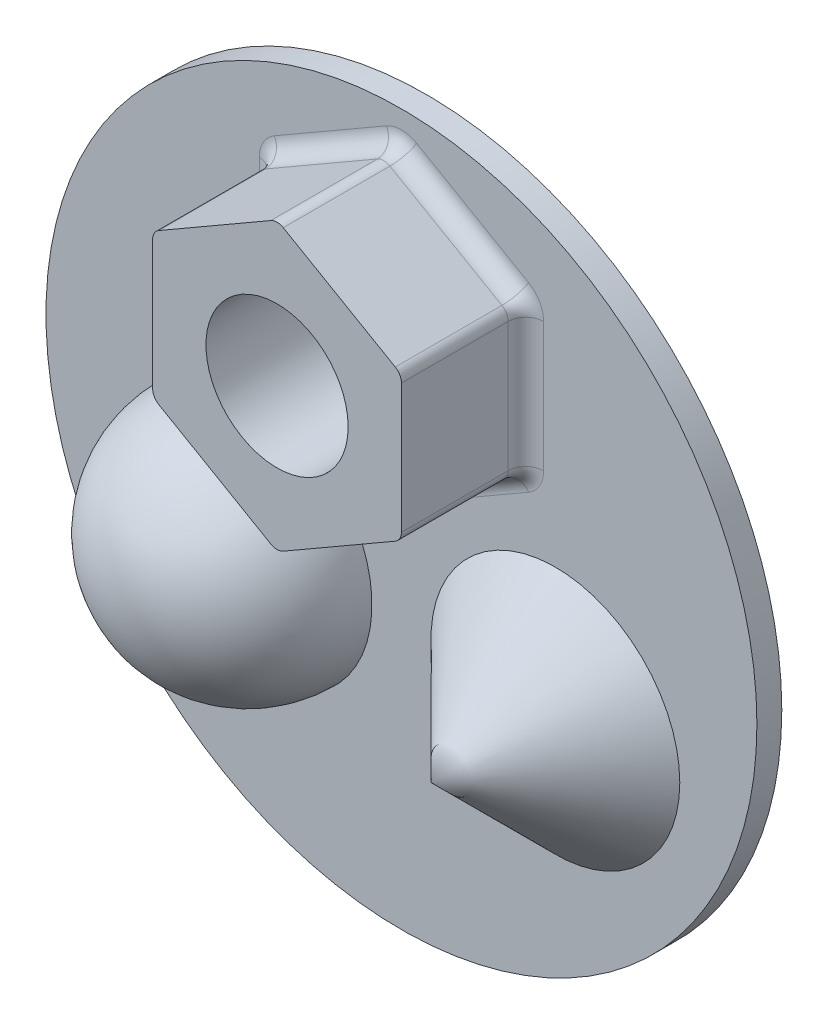
ISO-10303-21;
HEADER;
FILE_DESCRIPTION(('STEP AP214'),'2;1');
FILE_NAME('part.step','',(''),(''),'','','');
FILE_SCHEMA(('AUTOMOTIVE_DESIGN { 1 0 10303 214 1 1 1 1 }'));
ENDSEC;
DATA;
#1=APPLICATION_CONTEXT('core data for automotive mechanical design processes');
#2=APPLICATION_PROTOCOL_DEFINITION('international standard','automotive_design',2000,#1);
#3=PRODUCT_CONTEXT('',#1,'mechanical');
#4=PRODUCT('Part','Part','',(#3));
#5=PRODUCT_RELATED_PRODUCT_CATEGORY('part','',(#4));
#6=PRODUCT_DEFINITION_FORMATION('','',#4);
#7=PRODUCT_DEFINITION_CONTEXT('part definition',#1,'design');
#8=PRODUCT_DEFINITION('design','',#6,#7);
#9=PRODUCT_DEFINITION_SHAPE('','',#8);
#10=(LENGTH_UNIT() NAMED_UNIT(*) SI_UNIT(.MILLI.,.METRE.));
#11=(NAMED_UNIT(*) PLANE_ANGLE_UNIT() SI_UNIT($,.RADIAN.));
#12=(NAMED_UNIT(*) SI_UNIT($,.STERADIAN.) SOLID_ANGLE_UNIT());
#13=UNCERTAINTY_MEASURE_WITH_UNIT(LENGTH_MEASURE(1.E-05),#10,'distance_accuracy_value','');
#14=(GEOMETRIC_REPRESENTATION_CONTEXT(3) GLOBAL_UNCERTAINTY_ASSIGNED_CONTEXT((#13)) GLOBAL_UNIT_ASSIGNED_CONTEXT((#10,
#11,#12)) REPRESENTATION_CONTEXT('',''));
#15=CARTESIAN_POINT('',(0.,0.,0.));
#16=DIRECTION('',(0.,0.,1.));
#17=DIRECTION('',(1.,0.,0.));
#18=AXIS2_PLACEMENT_3D('',#15,#16,#17);
#19=CARTESIAN_POINT('',(0.,0.,0.7));
#20=DIRECTION('',(0.,0.,1.));
#21=DIRECTION('',(1.,0.,0.));
#22=AXIS2_PLACEMENT_3D('',#19,#20,#21);
#23=PLANE('',#22);
#24=DIRECTION('',(0.,1.,0.));
#25=VECTOR('',#24,1.);
#26=CARTESIAN_POINT('',(4.,0.,0.7));
#27=LINE('',#26,#25);
#28=CARTESIAN_POINT('',(4.,6.81865334794733,0.7));
#29=VERTEX_POINT('',#28);
#30=CARTESIAN_POINT('',(4.,3.18134665205268,0.7));
#31=VERTEX_POINT('',#30);
#32=EDGE_CURVE('E259',#29,#31,#27,.F.);
#33=ORIENTED_EDGE('',*,*,#32,.T.);
#34=CARTESIAN_POINT('',(3.15,3.18134665205268,0.7));
#35=DIRECTION('',(0.,0.,1.));
#36=DIRECTION('',(1.,0.,0.));
#37=AXIS2_PLACEMENT_3D('',#34,#35,#36);
#38=CIRCLE('',#37,0.85);
#39=CARTESIAN_POINT('',(3.575,2.44522505883591,0.7));
#40=VERTEX_POINT('',#39);
#41=EDGE_CURVE('E281',#31,#40,#38,.F.);
#42=ORIENTED_EDGE('',*,*,#41,.T.);
#43=DIRECTION('',(0.866025403784439,0.5,0.));
#44=VECTOR('',#43,1.);
#45=CARTESIAN_POINT('',(-0.165063509461096,0.285898384862245,0.7));
#46=LINE('',#45,#44);
#47=CARTESIAN_POINT('',(0.425,0.626571710888585,0.7));
#48=VERTEX_POINT('',#47);
#49=EDGE_CURVE('E279',#40,#48,#46,.F.);
#50=ORIENTED_EDGE('',*,*,#49,.T.);
#51=CARTESIAN_POINT('',(0.,1.36269330410536,0.7));
#52=DIRECTION('',(0.,0.,1.));
#53=DIRECTION('',(1.,0.,0.));
#54=AXIS2_PLACEMENT_3D('',#51,#52,#53);
#55=CIRCLE('',#54,0.85);
#56=CARTESIAN_POINT('',(-0.425000000000001,0.626571710888585,0.7));
#57=VERTEX_POINT('',#56);
#58=EDGE_CURVE('E277',#48,#57,#55,.F.);
#59=ORIENTED_EDGE('',*,*,#58,.T.);
#60=DIRECTION('',(0.866025403784439,-0.5,0.));
#61=VECTOR('',#60,1.);
#62=CARTESIAN_POINT('',(0.165063509461096,0.285898384862245,0.7));
#63=LINE('',#62,#61);
#64=CARTESIAN_POINT('',(-3.575,2.44522505883591,0.7));
#65=VERTEX_POINT('',#64);
#66=EDGE_CURVE('E275',#57,#65,#63,.F.);
#67=ORIENTED_EDGE('',*,*,#66,.T.);
#68=CARTESIAN_POINT('',(-3.15,3.18134665205268,0.7));
#69=DIRECTION('',(0.,0.,1.));
#70=DIRECTION('',(1.,0.,0.));
#71=AXIS2_PLACEMENT_3D('',#68,#69,#70);
#72=CIRCLE('',#71,0.85);
#73=CARTESIAN_POINT('',(-4.,3.18134665205268,0.7));
#74=VERTEX_POINT('',#73);
#75=EDGE_CURVE('E273',#65,#74,#72,.F.);
#76=ORIENTED_EDGE('',*,*,#75,.T.);
#77=DIRECTION('',(0.,-1.,0.));
#78=VECTOR('',#77,1.);
#79=CARTESIAN_POINT('',(-4.,0.,0.7));
#80=LINE('',#79,#78);
#81=CARTESIAN_POINT('',(-4.,6.81865334794732,0.7));
#82=VERTEX_POINT('',#81);
#83=EDGE_CURVE('E271',#74,#82,#80,.F.);
#84=ORIENTED_EDGE('',*,*,#83,.T.);
#85=CARTESIAN_POINT('',(-3.15,6.81865334794732,0.7));
#86=DIRECTION('',(0.,0.,1.));
#87=DIRECTION('',(1.,0.,0.));
#88=AXIS2_PLACEMENT_3D('',#85,#86,#87);
#89=CIRCLE('',#88,0.85);
#90=CARTESIAN_POINT('',(-3.575,7.55477494116409,0.7));
#91=VERTEX_POINT('',#90);
#92=EDGE_CURVE('E269',#82,#91,#89,.F.);
#93=ORIENTED_EDGE('',*,*,#92,.T.);
#94=DIRECTION('',(-0.866025403784438,-0.500000000000001,0.));
#95=VECTOR('',#94,1.);
#96=CARTESIAN_POINT('',(-4.1650635094611,7.21410161513775,0.7));
#97=LINE('',#96,#95);
#98=CARTESIAN_POINT('',(-0.424999999999998,9.37342828911142,0.7));
#99=VERTEX_POINT('',#98);
#100=EDGE_CURVE('E267',#91,#99,#97,.F.);
#101=ORIENTED_EDGE('',*,*,#100,.T.);
#102=CARTESIAN_POINT('',(0.,8.63730669589465,0.7));
#103=DIRECTION('',(0.,0.,1.));
#104=DIRECTION('',(1.,0.,0.));
#105=AXIS2_PLACEMENT_3D('',#102,#103,#104);
#106=CIRCLE('',#105,0.85);
#107=CARTESIAN_POINT('',(0.425000000000003,9.37342828911142,0.7));
#108=VERTEX_POINT('',#107);
#109=EDGE_CURVE('E265',#99,#108,#106,.F.);
#110=ORIENTED_EDGE('',*,*,#109,.T.);
#111=DIRECTION('',(-0.866025403784439,0.5,0.));
#112=VECTOR('',#111,1.);
#113=CARTESIAN_POINT('',(4.1650635094611,7.21410161513776,0.7));
#114=LINE('',#113,#112);
#115=CARTESIAN_POINT('',(3.575,7.5547749411641,0.7));
#116=VERTEX_POINT('',#115);
#117=EDGE_CURVE('E263',#108,#116,#114,.F.);
#118=ORIENTED_EDGE('',*,*,#117,.T.);
#119=CARTESIAN_POINT('',(3.15,6.81865334794733,0.7));
#120=DIRECTION('',(0.,0.,1.));
#121=DIRECTION('',(1.,0.,0.));
#122=AXIS2_PLACEMENT_3D('',#119,#120,#121);
#123=CIRCLE('',#122,0.85);
#124=EDGE_CURVE('E261',#116,#29,#123,.F.);
#125=ORIENTED_EDGE('',*,*,#124,.T.);
#126=EDGE_LOOP('',(#33,#42,#50,#59,#67,#76,#84,#93,#101,#110,#118,#125));
#127=FACE_BOUND('',#126,.T.);
#128=CARTESIAN_POINT('',(4.3301270189222,-2.49999999999999,0.7));
#129=DIRECTION('',(0.,0.,1.));
#130=DIRECTION('',(1.,0.,0.));
#131=AXIS2_PLACEMENT_3D('',#128,#129,#130);
#132=CIRCLE('',#131,3.5);
#133=CARTESIAN_POINT('',(7.8301270189222,-2.49999999999999,0.7));
#134=VERTEX_POINT('',#133);
#135=EDGE_CURVE('E207',#134,#134,#132,.T.);
#136=ORIENTED_EDGE('',*,*,#135,.F.);
#137=EDGE_LOOP('',(#136));
#138=FACE_BOUND('',#137,.T.);
#139=CARTESIAN_POINT('',(-4.3301270189222,-2.49999999999999,0.7));
#140=DIRECTION('',(0.,0.,-1.));
#141=DIRECTION('',(-1.,0.,0.));
#142=AXIS2_PLACEMENT_3D('',#139,#140,#141);
#143=CIRCLE('',#142,3.5);
#144=CARTESIAN_POINT('',(-7.8301270189222,-2.49999999999999,0.700000000000024));
#145=VERTEX_POINT('',#144);
#146=EDGE_CURVE('E210',#145,#145,#143,.T.);
#147=ORIENTED_EDGE('',*,*,#146,.T.);
#148=EDGE_LOOP('',(#147));
#149=FACE_BOUND('',#148,.T.);
#150=CARTESIAN_POINT('',(0.,0.,0.7));
#151=DIRECTION('',(0.,0.,1.));
#152=DIRECTION('',(1.,0.,0.));
#153=AXIS2_PLACEMENT_3D('',#150,#151,#152);
#154=CIRCLE('',#153,10.);
#155=CARTESIAN_POINT('',(10.,0.,0.7));
#156=VERTEX_POINT('',#155);
#157=EDGE_CURVE('E214',#156,#156,#154,.T.);
#158=ORIENTED_EDGE('',*,*,#157,.T.);
#159=EDGE_LOOP('',(#158));
#160=FACE_BOUND('',#159,.T.);
#161=ADVANCED_FACE('F39',(#127,#138,#149,#160),#23,.T.);
#162=CARTESIAN_POINT('',(0.,0.,0.7));
#163=DIRECTION('',(0.,0.,-1.));
#164=DIRECTION('',(-1.,0.,0.));
#165=AXIS2_PLACEMENT_3D('',#162,#163,#164);
#166=CYLINDRICAL_SURFACE('',#165,10.);
#167=ORIENTED_EDGE('',*,*,#157,.F.);
#168=EDGE_LOOP('',(#167));
#169=FACE_BOUND('',#168,.T.);
#170=CARTESIAN_POINT('',(0.,0.,0.));
#171=DIRECTION('',(0.,0.,1.));
#172=DIRECTION('',(1.,0.,0.));
#173=AXIS2_PLACEMENT_3D('',#170,#171,#172);
#174=CIRCLE('',#173,10.);
#175=CARTESIAN_POINT('',(10.,0.,0.));
#176=VERTEX_POINT('',#175);
#177=EDGE_CURVE('E213',#176,#176,#174,.T.);
#178=ORIENTED_EDGE('',*,*,#177,.T.);
#179=EDGE_LOOP('',(#178));
#180=FACE_BOUND('',#179,.T.);
#181=ADVANCED_FACE('F439',(#169,#180),#166,.T.);
#182=CARTESIAN_POINT('',(0.,0.,0.));
#183=DIRECTION('',(0.,0.,1.));
#184=DIRECTION('',(1.,0.,0.));
#185=AXIS2_PLACEMENT_3D('',#182,#183,#184);
#186=PLANE('',#185);
#187=CARTESIAN_POINT('',(4.3301270189222,-2.49999999999999,0.));
#188=DIRECTION('',(0.,0.,-1.));
#189=DIRECTION('',(-1.,0.,0.));
#190=AXIS2_PLACEMENT_3D('',#187,#188,#189);
#191=CIRCLE('',#190,2.);
#192=CARTESIAN_POINT('',(2.3301270189222,-2.49999999999999,0.));
#193=VERTEX_POINT('',#192);
#194=EDGE_CURVE('E176',#193,#193,#191,.T.);
#195=ORIENTED_EDGE('',*,*,#194,.F.);
#196=EDGE_LOOP('',(#195));
#197=FACE_BOUND('',#196,.T.);
#198=CARTESIAN_POINT('',(0.,5.,0.));
#199=DIRECTION('',(0.,0.,1.));
#200=DIRECTION('',(1.,0.,0.));
#201=AXIS2_PLACEMENT_3D('',#198,#199,#200);
#202=CIRCLE('',#201,2.);
#203=CARTESIAN_POINT('',(2.,5.,0.));
#204=VERTEX_POINT('',#203);
#205=EDGE_CURVE('E186',#204,#204,#202,.T.);
#206=ORIENTED_EDGE('',*,*,#205,.T.);
#207=EDGE_LOOP('',(#206));
#208=FACE_BOUND('',#207,.T.);
#209=ORIENTED_EDGE('',*,*,#177,.F.);
#210=EDGE_LOOP('',(#209));
#211=FACE_BOUND('',#210,.T.);
#212=ADVANCED_FACE('F446',(#197,#208,#211),#186,.F.);
#213=CARTESIAN_POINT('',(-4.3301270189222,-2.49999999999999,0.7));
#214=DIRECTION('',(0.,-1.,0.));
#215=DIRECTION('',(1.,0.,0.));
#216=AXIS2_PLACEMENT_3D('',#213,#214,#215);
#217=SPHERICAL_SURFACE('',#216,3.5);
#218=CARTESIAN_POINT('',(-4.3301270189222,-2.49999999999999,0.7));
#219=DIRECTION('',(0.,0.,-1.));
#220=DIRECTION('',(-1.,0.,0.));
#221=AXIS2_PLACEMENT_3D('',#218,#219,#220);
#222=SPHERICAL_SURFACE('',#221,3.5);
#223=ORIENTED_EDGE('',*,*,#146,.F.);
#224=EDGE_LOOP('',(#223));
#225=FACE_BOUND('',#224,.T.);
#226=ADVANCED_FACE('F451',(#225),#222,.T.);
#227=CARTESIAN_POINT('',(4.3301270189222,-2.49999999999999,0.7));
#228=DIRECTION('',(0.,0.,-1.));
#229=DIRECTION('',(1.,0.,0.));
#230=AXIS2_PLACEMENT_3D('',#227,#228,#229);
#231=CONICAL_SURFACE('',#230,3.5,0.78539816339745);
#232=CARTESIAN_POINT('',(4.3301270189222,-2.49999999999999,4.19999999999999));
#233=VERTEX_POINT('',#232);
#234=VERTEX_LOOP('',#233);
#235=FACE_BOUND('',#234,.T.);
#236=ORIENTED_EDGE('',*,*,#135,.T.);
#237=EDGE_LOOP('',(#236));
#238=FACE_BOUND('',#237,.T.);
#239=ADVANCED_FACE('F592',(#235,#238),#231,.T.);
#240=CARTESIAN_POINT('',(-3.5,7.02072594216369,4.19999999999999));
#241=DIRECTION('',(1.,0.,0.));
#242=DIRECTION('',(0.,1.,0.));
#243=AXIS2_PLACEMENT_3D('',#240,#241,#242);
#244=PLANE('',#243);
#245=DIRECTION('',(0.,0.,-1.));
#246=VECTOR('',#245,1.);
#247=CARTESIAN_POINT('',(-3.5,6.81865334794732,4.19999999999999));
#248=LINE('',#247,#246);
#249=CARTESIAN_POINT('',(-3.5,6.81865334794732,4.19999999999999));
#250=VERTEX_POINT('',#249);
#251=CARTESIAN_POINT('',(-3.5,6.81865334794732,1.2));
#252=VERTEX_POINT('',#251);
#253=EDGE_CURVE('E242',#250,#252,#248,.T.);
#254=ORIENTED_EDGE('',*,*,#253,.T.);
#255=DIRECTION('',(0.,-1.,0.));
#256=VECTOR('',#255,1.);
#257=CARTESIAN_POINT('',(-3.5,7.02072594216369,1.2));
#258=LINE('',#257,#256);
#259=CARTESIAN_POINT('',(-3.5,3.18134665205268,1.2));
#260=VERTEX_POINT('',#259);
#261=EDGE_CURVE('E295',#252,#260,#258,.T.);
#262=ORIENTED_EDGE('',*,*,#261,.T.);
#263=DIRECTION('',(0.,0.,-1.));
#264=VECTOR('',#263,1.);
#265=CARTESIAN_POINT('',(-3.5,3.18134665205268,4.19999999999999));
#266=LINE('',#265,#264);
#267=CARTESIAN_POINT('',(-3.5,3.18134665205268,4.19999999999999));
#268=VERTEX_POINT('',#267);
#269=EDGE_CURVE('E240',#260,#268,#266,.F.);
#270=ORIENTED_EDGE('',*,*,#269,.T.);
#271=DIRECTION('',(0.,-1.,0.));
#272=VECTOR('',#271,1.);
#273=CARTESIAN_POINT('',(-3.5,7.02072594216369,4.19999999999999));
#274=LINE('',#273,#272);
#275=EDGE_CURVE('E189',#250,#268,#274,.T.);
#276=ORIENTED_EDGE('',*,*,#275,.F.);
#277=EDGE_LOOP('',(#254,#262,#270,#276));
#278=FACE_BOUND('',#277,.T.);
#279=ADVANCED_FACE('F353',(#278),#244,.F.);
#280=CARTESIAN_POINT('',(-3.5,2.97927405783631,4.19999999999999));
#281=DIRECTION('',(0.5,0.866025403784439,0.));
#282=DIRECTION('',(-0.866025403784439,0.5,0.));
#283=AXIS2_PLACEMENT_3D('',#280,#281,#282);
#284=PLANE('',#283);
#285=DIRECTION('',(0.,0.,-1.));
#286=VECTOR('',#285,1.);
#287=CARTESIAN_POINT('',(-3.325,2.87823776072813,4.19999999999999));
#288=LINE('',#287,#286);
#289=CARTESIAN_POINT('',(-3.325,2.87823776072813,4.19999999999999));
#290=VERTEX_POINT('',#289);
#291=CARTESIAN_POINT('',(-3.325,2.87823776072813,1.2));
#292=VERTEX_POINT('',#291);
#293=EDGE_CURVE('E247',#290,#292,#288,.T.);
#294=ORIENTED_EDGE('',*,*,#293,.T.);
#295=DIRECTION('',(0.866025403784439,-0.5,0.));
#296=VECTOR('',#295,1.);
#297=CARTESIAN_POINT('',(-3.5,2.97927405783631,1.2));
#298=LINE('',#297,#296);
#299=CARTESIAN_POINT('',(-0.175,1.0595844127808,1.2));
#300=VERTEX_POINT('',#299);
#301=EDGE_CURVE('E291',#292,#300,#298,.T.);
#302=ORIENTED_EDGE('',*,*,#301,.T.);
#303=DIRECTION('',(0.,0.,-1.));
#304=VECTOR('',#303,1.);
#305=CARTESIAN_POINT('',(-0.175,1.0595844127808,4.19999999999999));
#306=LINE('',#305,#304);
#307=CARTESIAN_POINT('',(-0.174999999999999,1.0595844127808,4.19999999999999));
#308=VERTEX_POINT('',#307);
#309=EDGE_CURVE('E245',#300,#308,#306,.F.);
#310=ORIENTED_EDGE('',*,*,#309,.T.);
#311=DIRECTION('',(0.866025403784439,-0.5,0.));
#312=VECTOR('',#311,1.);
#313=CARTESIAN_POINT('',(-3.5,2.97927405783631,4.19999999999999));
#314=LINE('',#313,#312);
#315=EDGE_CURVE('E192',#290,#308,#314,.T.);
#316=ORIENTED_EDGE('',*,*,#315,.F.);
#317=EDGE_LOOP('',(#294,#302,#310,#316));
#318=FACE_BOUND('',#317,.T.);
#319=ADVANCED_FACE('F366',(#318),#284,.F.);
#320=CARTESIAN_POINT('',(0.,0.958548115672619,4.19999999999999));
#321=DIRECTION('',(-0.5,0.866025403784438,0.));
#322=DIRECTION('',(-0.866025403784439,-0.5,0.));
#323=AXIS2_PLACEMENT_3D('',#320,#321,#322);
#324=PLANE('',#323);
#325=DIRECTION('',(0.,0.,-1.));
#326=VECTOR('',#325,1.);
#327=CARTESIAN_POINT('',(0.175,1.0595844127808,4.19999999999999));
#328=LINE('',#327,#326);
#329=CARTESIAN_POINT('',(0.175,1.0595844127808,4.19999999999999));
#330=VERTEX_POINT('',#329);
#331=CARTESIAN_POINT('',(0.175,1.0595844127808,1.2));
#332=VERTEX_POINT('',#331);
#333=EDGE_CURVE('E254',#330,#332,#328,.T.);
#334=ORIENTED_EDGE('',*,*,#333,.T.);
#335=DIRECTION('',(0.866025403784439,0.5,0.));
#336=VECTOR('',#335,1.);
#337=CARTESIAN_POINT('',(0.,0.958548115672619,1.2));
#338=LINE('',#337,#336);
#339=CARTESIAN_POINT('',(3.325,2.87823776072813,1.2));
#340=VERTEX_POINT('',#339);
#341=EDGE_CURVE('E287',#332,#340,#338,.T.);
#342=ORIENTED_EDGE('',*,*,#341,.T.);
#343=DIRECTION('',(0.,0.,-1.));
#344=VECTOR('',#343,1.);
#345=CARTESIAN_POINT('',(3.325,2.87823776072813,4.19999999999999));
#346=LINE('',#345,#344);
#347=CARTESIAN_POINT('',(3.325,2.87823776072813,4.19999999999999));
#348=VERTEX_POINT('',#347);
#349=EDGE_CURVE('E257',#340,#348,#346,.F.);
#350=ORIENTED_EDGE('',*,*,#349,.T.);
#351=DIRECTION('',(0.866025403784439,0.5,0.));
#352=VECTOR('',#351,1.);
#353=CARTESIAN_POINT('',(0.,0.958548115672619,4.19999999999999));
#354=LINE('',#353,#352);
#355=EDGE_CURVE('E195',#330,#348,#354,.T.);
#356=ORIENTED_EDGE('',*,*,#355,.F.);
#357=EDGE_LOOP('',(#334,#342,#350,#356));
#358=FACE_BOUND('',#357,.T.);
#359=ADVANCED_FACE('F388',(#358),#324,.F.);
#360=CARTESIAN_POINT('',(3.5,2.97927405783631,4.19999999999999));
#361=DIRECTION('',(-1.,0.,0.));
#362=DIRECTION('',(0.,-1.,0.));
#363=AXIS2_PLACEMENT_3D('',#360,#361,#362);
#364=PLANE('',#363);
#365=DIRECTION('',(0.,0.,-1.));
#366=VECTOR('',#365,1.);
#367=CARTESIAN_POINT('',(3.5,3.18134665205268,4.19999999999999));
#368=LINE('',#367,#366);
#369=CARTESIAN_POINT('',(3.5,3.18134665205268,4.19999999999999));
#370=VERTEX_POINT('',#369);
#371=CARTESIAN_POINT('',(3.5,3.18134665205268,1.2));
#372=VERTEX_POINT('',#371);
#373=EDGE_CURVE('E250',#370,#372,#368,.T.);
#374=ORIENTED_EDGE('',*,*,#373,.T.);
#375=DIRECTION('',(0.,1.,0.));
#376=VECTOR('',#375,1.);
#377=CARTESIAN_POINT('',(3.5,2.97927405783631,1.2));
#378=LINE('',#377,#376);
#379=CARTESIAN_POINT('',(3.5,6.81865334794733,1.2));
#380=VERTEX_POINT('',#379);
#381=EDGE_CURVE('E11',#372,#380,#378,.T.);
#382=ORIENTED_EDGE('',*,*,#381,.T.);
#383=DIRECTION('',(0.,0.,-1.));
#384=VECTOR('',#383,1.);
#385=CARTESIAN_POINT('',(3.5,6.81865334794733,4.19999999999999));
#386=LINE('',#385,#384);
#387=CARTESIAN_POINT('',(3.5,6.81865334794733,4.19999999999999));
#388=VERTEX_POINT('',#387);
#389=EDGE_CURVE('E252',#380,#388,#386,.F.);
#390=ORIENTED_EDGE('',*,*,#389,.T.);
#391=DIRECTION('',(0.,1.,0.));
#392=VECTOR('',#391,1.);
#393=CARTESIAN_POINT('',(3.5,2.97927405783631,4.19999999999999));
#394=LINE('',#393,#392);
#395=EDGE_CURVE('E198',#370,#388,#394,.T.);
#396=ORIENTED_EDGE('',*,*,#395,.F.);
#397=EDGE_LOOP('',(#374,#382,#390,#396));
#398=FACE_BOUND('',#397,.T.);
#399=ADVANCED_FACE('F396',(#398),#364,.F.);
#400=CARTESIAN_POINT('',(3.5,7.02072594216369,4.19999999999999));
#401=DIRECTION('',(-0.5,-0.866025403784438,0.));
#402=DIRECTION('',(0.866025403784439,-0.5,0.));
#403=AXIS2_PLACEMENT_3D('',#400,#401,#402);
#404=PLANE('',#403);
#405=DIRECTION('',(0.,0.,-1.));
#406=VECTOR('',#405,1.);
#407=CARTESIAN_POINT('',(3.325,7.12176223927188,4.19999999999999));
#408=LINE('',#407,#406);
#409=CARTESIAN_POINT('',(3.325,7.12176223927188,4.19999999999999));
#410=VERTEX_POINT('',#409);
#411=CARTESIAN_POINT('',(3.325,7.12176223927188,1.2));
#412=VERTEX_POINT('',#411);
#413=EDGE_CURVE('E224',#410,#412,#408,.T.);
#414=ORIENTED_EDGE('',*,*,#413,.T.);
#415=DIRECTION('',(-0.866025403784439,0.5,0.));
#416=VECTOR('',#415,1.);
#417=CARTESIAN_POINT('',(3.5,7.02072594216369,1.2));
#418=LINE('',#417,#416);
#419=CARTESIAN_POINT('',(0.175000000000002,8.9404155872192,1.2));
#420=VERTEX_POINT('',#419);
#421=EDGE_CURVE('E303',#412,#420,#418,.T.);
#422=ORIENTED_EDGE('',*,*,#421,.T.);
#423=DIRECTION('',(0.,0.,-1.));
#424=VECTOR('',#423,1.);
#425=CARTESIAN_POINT('',(0.175000000000002,8.9404155872192,4.19999999999999));
#426=LINE('',#425,#424);
#427=CARTESIAN_POINT('',(0.175000000000003,8.9404155872192,4.19999999999999));
#428=VERTEX_POINT('',#427);
#429=EDGE_CURVE('E226',#420,#428,#426,.F.);
#430=ORIENTED_EDGE('',*,*,#429,.T.);
#431=DIRECTION('',(-0.866025403784438,0.5,0.));
#432=VECTOR('',#431,1.);
#433=CARTESIAN_POINT('',(3.5,7.02072594216369,4.19999999999999));
#434=LINE('',#433,#432);
#435=EDGE_CURVE('E201',#410,#428,#434,.T.);
#436=ORIENTED_EDGE('',*,*,#435,.F.);
#437=EDGE_LOOP('',(#414,#422,#430,#436));
#438=FACE_BOUND('',#437,.T.);
#439=ADVANCED_FACE('F402',(#438),#404,.F.);
#440=CARTESIAN_POINT('',(0.,9.04145188432738,4.19999999999999));
#441=DIRECTION('',(0.5,-0.866025403784438,0.));
#442=DIRECTION('',(0.866025403784438,0.500000000000001,0.));
#443=AXIS2_PLACEMENT_3D('',#440,#441,#442);
#444=PLANE('',#443);
#445=DIRECTION('',(0.,0.,-1.));
#446=VECTOR('',#445,1.);
#447=CARTESIAN_POINT('',(-0.174999999999998,8.9404155872192,4.19999999999999));
#448=LINE('',#447,#446);
#449=CARTESIAN_POINT('',(-0.174999999999998,8.9404155872192,4.19999999999999));
#450=VERTEX_POINT('',#449);
#451=CARTESIAN_POINT('',(-0.174999999999998,8.9404155872192,1.2));
#452=VERTEX_POINT('',#451);
#453=EDGE_CURVE('E221',#450,#452,#448,.T.);
#454=ORIENTED_EDGE('',*,*,#453,.T.);
#455=DIRECTION('',(-0.866025403784438,-0.500000000000001,0.));
#456=VECTOR('',#455,1.);
#457=CARTESIAN_POINT('',(0.,9.04145188432738,1.2));
#458=LINE('',#457,#456);
#459=CARTESIAN_POINT('',(-3.325,7.12176223927187,1.2));
#460=VERTEX_POINT('',#459);
#461=EDGE_CURVE('E299',#452,#460,#458,.T.);
#462=ORIENTED_EDGE('',*,*,#461,.T.);
#463=DIRECTION('',(0.,0.,-1.));
#464=VECTOR('',#463,1.);
#465=CARTESIAN_POINT('',(-3.325,7.12176223927187,4.19999999999999));
#466=LINE('',#465,#464);
#467=CARTESIAN_POINT('',(-3.325,7.12176223927187,4.19999999999999));
#468=VERTEX_POINT('',#467);
#469=EDGE_CURVE('E217',#460,#468,#466,.F.);
#470=ORIENTED_EDGE('',*,*,#469,.T.);
#471=DIRECTION('',(-0.866025403784438,-0.5,0.));
#472=VECTOR('',#471,1.);
#473=CARTESIAN_POINT('',(0.,9.04145188432738,4.19999999999999));
#474=LINE('',#473,#472);
#475=EDGE_CURVE('E204',#450,#468,#474,.T.);
#476=ORIENTED_EDGE('',*,*,#475,.F.);
#477=EDGE_LOOP('',(#454,#462,#470,#476));
#478=FACE_BOUND('',#477,.T.);
#479=ADVANCED_FACE('F427',(#478),#444,.F.);
#480=CARTESIAN_POINT('',(0.,0.,4.19999999999999));
#481=DIRECTION('',(0.,0.,1.));
#482=DIRECTION('',(1.,0.,0.));
#483=AXIS2_PLACEMENT_3D('',#480,#481,#482);
#484=PLANE('',#483);
#485=CARTESIAN_POINT('',(0.,5.,4.19999999999999));
#486=DIRECTION('',(0.,0.,1.));
#487=DIRECTION('',(1.,0.,0.));
#488=AXIS2_PLACEMENT_3D('',#485,#486,#487);
#489=CIRCLE('',#488,2.);
#490=CARTESIAN_POINT('',(2.,5.,4.19999999999999));
#491=VERTEX_POINT('',#490);
#492=EDGE_CURVE('E183',#491,#491,#489,.T.);
#493=ORIENTED_EDGE('',*,*,#492,.F.);
#494=EDGE_LOOP('',(#493));
#495=FACE_BOUND('',#494,.T.);
#496=ORIENTED_EDGE('',*,*,#435,.T.);
#497=CARTESIAN_POINT('',(0.,8.63730669589465,4.19999999999999));
#498=DIRECTION('',(0.,0.,1.));
#499=DIRECTION('',(1.,0.,0.));
#500=AXIS2_PLACEMENT_3D('',#497,#498,#499);
#501=CIRCLE('',#500,0.35);
#502=EDGE_CURVE('E238',#428,#450,#501,.T.);
#503=ORIENTED_EDGE('',*,*,#502,.T.);
#504=ORIENTED_EDGE('',*,*,#475,.T.);
#505=CARTESIAN_POINT('',(-3.15,6.81865334794732,4.19999999999999));
#506=DIRECTION('',(0.,0.,1.));
#507=DIRECTION('',(1.,0.,0.));
#508=AXIS2_PLACEMENT_3D('',#505,#506,#507);
#509=CIRCLE('',#508,0.35);
#510=EDGE_CURVE('E236',#468,#250,#509,.T.);
#511=ORIENTED_EDGE('',*,*,#510,.T.);
#512=ORIENTED_EDGE('',*,*,#275,.T.);
#513=CARTESIAN_POINT('',(-3.15,3.18134665205268,4.19999999999999));
#514=DIRECTION('',(0.,0.,1.));
#515=DIRECTION('',(1.,0.,0.));
#516=AXIS2_PLACEMENT_3D('',#513,#514,#515);
#517=CIRCLE('',#516,0.35);
#518=EDGE_CURVE('E234',#268,#290,#517,.T.);
#519=ORIENTED_EDGE('',*,*,#518,.T.);
#520=ORIENTED_EDGE('',*,*,#315,.T.);
#521=CARTESIAN_POINT('',(0.,1.36269330410536,4.19999999999999));
#522=DIRECTION('',(0.,0.,1.));
#523=DIRECTION('',(1.,0.,0.));
#524=AXIS2_PLACEMENT_3D('',#521,#522,#523);
#525=CIRCLE('',#524,0.35);
#526=EDGE_CURVE('E228',#308,#330,#525,.T.);
#527=ORIENTED_EDGE('',*,*,#526,.T.);
#528=ORIENTED_EDGE('',*,*,#355,.T.);
#529=CARTESIAN_POINT('',(3.15,3.18134665205268,4.19999999999999));
#530=DIRECTION('',(0.,0.,1.));
#531=DIRECTION('',(1.,0.,0.));
#532=AXIS2_PLACEMENT_3D('',#529,#530,#531);
#533=CIRCLE('',#532,0.35);
#534=EDGE_CURVE('E230',#348,#370,#533,.T.);
#535=ORIENTED_EDGE('',*,*,#534,.T.);
#536=ORIENTED_EDGE('',*,*,#395,.T.);
#537=CARTESIAN_POINT('',(3.15,6.81865334794733,4.19999999999999));
#538=DIRECTION('',(0.,0.,1.));
#539=DIRECTION('',(1.,0.,0.));
#540=AXIS2_PLACEMENT_3D('',#537,#538,#539);
#541=CIRCLE('',#540,0.35);
#542=EDGE_CURVE('E232',#388,#410,#541,.T.);
#543=ORIENTED_EDGE('',*,*,#542,.T.);
#544=EDGE_LOOP('',(#496,#503,#504,#511,#512,#519,#520,#527,#528,#535,#536,#543));
#545=FACE_BOUND('',#544,.T.);
#546=ADVANCED_FACE('F357',(#495,#545),#484,.T.);
#547=CARTESIAN_POINT('',(0.,8.63730669589465,4.19999999999999));
#548=DIRECTION('',(0.,0.,-1.));
#549=DIRECTION('',(-1.,0.,0.));
#550=AXIS2_PLACEMENT_3D('',#547,#548,#549);
#551=CYLINDRICAL_SURFACE('',#550,0.35);
#552=ORIENTED_EDGE('',*,*,#429,.F.);
#553=CARTESIAN_POINT('',(0.,8.63730669589465,1.2));
#554=DIRECTION('',(0.,0.,1.));
#555=DIRECTION('',(1.,0.,0.));
#556=AXIS2_PLACEMENT_3D('',#553,#554,#555);
#557=CIRCLE('',#556,0.35);
#558=EDGE_CURVE('E301',#420,#452,#557,.T.);
#559=ORIENTED_EDGE('',*,*,#558,.T.);
#560=ORIENTED_EDGE('',*,*,#453,.F.);
#561=ORIENTED_EDGE('',*,*,#502,.F.);
#562=EDGE_LOOP('',(#552,#559,#560,#561));
#563=FACE_BOUND('',#562,.T.);
#564=ADVANCED_FACE('F423',(#563),#551,.T.);
#565=CARTESIAN_POINT('',(-3.15,6.81865334794732,4.19999999999999));
#566=DIRECTION('',(0.,0.,-1.));
#567=DIRECTION('',(-1.,0.,0.));
#568=AXIS2_PLACEMENT_3D('',#565,#566,#567);
#569=CYLINDRICAL_SURFACE('',#568,0.35);
#570=ORIENTED_EDGE('',*,*,#469,.F.);
#571=CARTESIAN_POINT('',(-3.15,6.81865334794732,1.2));
#572=DIRECTION('',(0.,0.,1.));
#573=DIRECTION('',(1.,0.,0.));
#574=AXIS2_PLACEMENT_3D('',#571,#572,#573);
#575=CIRCLE('',#574,0.35);
#576=EDGE_CURVE('E297',#460,#252,#575,.T.);
#577=ORIENTED_EDGE('',*,*,#576,.T.);
#578=ORIENTED_EDGE('',*,*,#253,.F.);
#579=ORIENTED_EDGE('',*,*,#510,.F.);
#580=EDGE_LOOP('',(#570,#577,#578,#579));
#581=FACE_BOUND('',#580,.T.);
#582=ADVANCED_FACE('F349',(#581),#569,.T.);
#583=CARTESIAN_POINT('',(-3.15,3.18134665205268,4.19999999999999));
#584=DIRECTION('',(0.,0.,-1.));
#585=DIRECTION('',(-1.,0.,0.));
#586=AXIS2_PLACEMENT_3D('',#583,#584,#585);
#587=CYLINDRICAL_SURFACE('',#586,0.35);
#588=ORIENTED_EDGE('',*,*,#269,.F.);
#589=CARTESIAN_POINT('',(-3.15,3.18134665205268,1.2));
#590=DIRECTION('',(0.,0.,1.));
#591=DIRECTION('',(1.,0.,0.));
#592=AXIS2_PLACEMENT_3D('',#589,#590,#591);
#593=CIRCLE('',#592,0.35);
#594=EDGE_CURVE('E293',#260,#292,#593,.T.);
#595=ORIENTED_EDGE('',*,*,#594,.T.);
#596=ORIENTED_EDGE('',*,*,#293,.F.);
#597=ORIENTED_EDGE('',*,*,#518,.F.);
#598=EDGE_LOOP('',(#588,#595,#596,#597));
#599=FACE_BOUND('',#598,.T.);
#600=ADVANCED_FACE('F361',(#599),#587,.T.);
#601=CARTESIAN_POINT('',(3.15,6.81865334794733,4.19999999999999));
#602=DIRECTION('',(0.,0.,-1.));
#603=DIRECTION('',(-1.,0.,0.));
#604=AXIS2_PLACEMENT_3D('',#601,#602,#603);
#605=CYLINDRICAL_SURFACE('',#604,0.35);
#606=ORIENTED_EDGE('',*,*,#389,.F.);
#607=CARTESIAN_POINT('',(3.15,6.81865334794733,1.2));
#608=DIRECTION('',(0.,0.,1.));
#609=DIRECTION('',(1.,0.,0.));
#610=AXIS2_PLACEMENT_3D('',#607,#608,#609);
#611=CIRCLE('',#610,0.35);
#612=EDGE_CURVE('E48',#380,#412,#611,.T.);
#613=ORIENTED_EDGE('',*,*,#612,.T.);
#614=ORIENTED_EDGE('',*,*,#413,.F.);
#615=ORIENTED_EDGE('',*,*,#542,.F.);
#616=EDGE_LOOP('',(#606,#613,#614,#615));
#617=FACE_BOUND('',#616,.T.);
#618=ADVANCED_FACE('F399',(#617),#605,.T.);
#619=CARTESIAN_POINT('',(3.15,3.18134665205268,4.19999999999999));
#620=DIRECTION('',(0.,0.,-1.));
#621=DIRECTION('',(-1.,0.,0.));
#622=AXIS2_PLACEMENT_3D('',#619,#620,#621);
#623=CYLINDRICAL_SURFACE('',#622,0.35);
#624=ORIENTED_EDGE('',*,*,#349,.F.);
#625=CARTESIAN_POINT('',(3.15,3.18134665205268,1.2));
#626=DIRECTION('',(0.,0.,1.));
#627=DIRECTION('',(1.,0.,0.));
#628=AXIS2_PLACEMENT_3D('',#625,#626,#627);
#629=CIRCLE('',#628,0.35);
#630=EDGE_CURVE('E284',#340,#372,#629,.T.);
#631=ORIENTED_EDGE('',*,*,#630,.T.);
#632=ORIENTED_EDGE('',*,*,#373,.F.);
#633=ORIENTED_EDGE('',*,*,#534,.F.);
#634=EDGE_LOOP('',(#624,#631,#632,#633));
#635=FACE_BOUND('',#634,.T.);
#636=ADVANCED_FACE('F394',(#635),#623,.T.);
#637=CARTESIAN_POINT('',(0.,1.36269330410536,4.19999999999999));
#638=DIRECTION('',(0.,0.,-1.));
#639=DIRECTION('',(-1.,0.,0.));
#640=AXIS2_PLACEMENT_3D('',#637,#638,#639);
#641=CYLINDRICAL_SURFACE('',#640,0.35);
#642=ORIENTED_EDGE('',*,*,#309,.F.);
#643=CARTESIAN_POINT('',(0.,1.36269330410536,1.2));
#644=DIRECTION('',(0.,0.,1.));
#645=DIRECTION('',(1.,0.,0.));
#646=AXIS2_PLACEMENT_3D('',#643,#644,#645);
#647=CIRCLE('',#646,0.35);
#648=EDGE_CURVE('E289',#300,#332,#647,.T.);
#649=ORIENTED_EDGE('',*,*,#648,.T.);
#650=ORIENTED_EDGE('',*,*,#333,.F.);
#651=ORIENTED_EDGE('',*,*,#526,.F.);
#652=EDGE_LOOP('',(#642,#649,#650,#651));
#653=FACE_BOUND('',#652,.T.);
#654=ADVANCED_FACE('F384',(#653),#641,.T.);
#655=CARTESIAN_POINT('',(0.,5.,-5.80000000000001));
#656=DIRECTION('',(0.,0.,1.));
#657=DIRECTION('',(1.,0.,0.));
#658=AXIS2_PLACEMENT_3D('',#655,#656,#657);
#659=CYLINDRICAL_SURFACE('',#658,2.);
#660=ORIENTED_EDGE('',*,*,#492,.T.);
#661=EDGE_LOOP('',(#660));
#662=FACE_BOUND('',#661,.T.);
#663=ORIENTED_EDGE('',*,*,#205,.F.);
#664=EDGE_LOOP('',(#663));
#665=FACE_BOUND('',#664,.T.);
#666=ADVANCED_FACE('F466',(#662,#665),#659,.F.);
#667=CARTESIAN_POINT('',(-3.15,6.81865334794732,1.2));
#668=DIRECTION('',(0.,0.,1.));
#669=DIRECTION('',(1.,0.,0.));
#670=AXIS2_PLACEMENT_3D('',#667,#668,#669);
#671=TOROIDAL_SURFACE('',#670,0.85,0.5);
#672=CARTESIAN_POINT('',(-4.,6.81865334794732,1.2));
#673=DIRECTION('',(0.,1.,0.));
#674=DIRECTION('',(0.,0.,1.));
#675=AXIS2_PLACEMENT_3D('',#672,#673,#674);
#676=CIRCLE('',#675,0.5);
#677=EDGE_CURVE('E330',#252,#82,#676,.T.);
#678=ORIENTED_EDGE('',*,*,#677,.F.);
#679=ORIENTED_EDGE('',*,*,#576,.F.);
#680=CARTESIAN_POINT('',(-3.575,7.55477494116409,1.2));
#681=DIRECTION('',(-0.866025403784438,-0.500000000000001,0.));
#682=DIRECTION('',(0.500000000000002,-0.866025403784438,0.));
#683=AXIS2_PLACEMENT_3D('',#680,#681,#682);
#684=CIRCLE('',#683,0.5);
#685=EDGE_CURVE('E43',#91,#460,#684,.T.);
#686=ORIENTED_EDGE('',*,*,#685,.F.);
#687=ORIENTED_EDGE('',*,*,#92,.F.);
#688=EDGE_LOOP('',(#678,#679,#686,#687));
#689=FACE_BOUND('',#688,.T.);
#690=ADVANCED_FACE('F41',(#689),#671,.F.);
#691=CARTESIAN_POINT('',(-0.25,9.4744645862196,1.2));
#692=DIRECTION('',(-0.866025403784438,-0.500000000000001,0.));
#693=DIRECTION('',(0.500000000000001,-0.866025403784438,0.));
#694=AXIS2_PLACEMENT_3D('',#691,#692,#693);
#695=CYLINDRICAL_SURFACE('',#694,0.5);
#696=ORIENTED_EDGE('',*,*,#685,.T.);
#697=ORIENTED_EDGE('',*,*,#461,.F.);
#698=CARTESIAN_POINT('',(-0.424999999999999,9.37342828911142,1.2));
#699=DIRECTION('',(-0.866025403784438,-0.5,0.));
#700=DIRECTION('',(0.5,-0.866025403784439,0.));
#701=AXIS2_PLACEMENT_3D('',#698,#699,#700);
#702=CIRCLE('',#701,0.5);
#703=EDGE_CURVE('E328',#99,#452,#702,.T.);
#704=ORIENTED_EDGE('',*,*,#703,.F.);
#705=ORIENTED_EDGE('',*,*,#100,.F.);
#706=EDGE_LOOP('',(#696,#697,#704,#705));
#707=FACE_BOUND('',#706,.T.);
#708=ADVANCED_FACE('F341',(#707),#695,.F.);
#709=CARTESIAN_POINT('',(-4.,7.02072594216369,1.2));
#710=DIRECTION('',(0.,-1.,0.));
#711=DIRECTION('',(1.,0.,0.));
#712=AXIS2_PLACEMENT_3D('',#709,#710,#711);
#713=CYLINDRICAL_SURFACE('',#712,0.5);
#714=ORIENTED_EDGE('',*,*,#677,.T.);
#715=ORIENTED_EDGE('',*,*,#83,.F.);
#716=CARTESIAN_POINT('',(-4.,3.18134665205268,1.2));
#717=DIRECTION('',(0.,1.,0.));
#718=DIRECTION('',(0.,0.,1.));
#719=AXIS2_PLACEMENT_3D('',#716,#717,#718);
#720=CIRCLE('',#719,0.5);
#721=EDGE_CURVE('E325',#260,#74,#720,.T.);
#722=ORIENTED_EDGE('',*,*,#721,.F.);
#723=ORIENTED_EDGE('',*,*,#261,.F.);
#724=EDGE_LOOP('',(#714,#715,#722,#723));
#725=FACE_BOUND('',#724,.T.);
#726=ADVANCED_FACE('F490',(#725),#713,.F.);
#727=CARTESIAN_POINT('',(0.,8.63730669589465,1.2));
#728=DIRECTION('',(0.,0.,1.));
#729=DIRECTION('',(1.,0.,0.));
#730=AXIS2_PLACEMENT_3D('',#727,#728,#729);
#731=TOROIDAL_SURFACE('',#730,0.85,0.5);
#732=ORIENTED_EDGE('',*,*,#703,.T.);
#733=ORIENTED_EDGE('',*,*,#558,.F.);
#734=CARTESIAN_POINT('',(0.425000000000003,9.37342828911142,1.2));
#735=DIRECTION('',(-0.866025403784438,0.500000000000002,0.));
#736=DIRECTION('',(-0.500000000000002,-0.866025403784438,0.));
#737=AXIS2_PLACEMENT_3D('',#734,#735,#736);
#738=CIRCLE('',#737,0.5);
#739=EDGE_CURVE('E322',#108,#420,#738,.T.);
#740=ORIENTED_EDGE('',*,*,#739,.F.);
#741=ORIENTED_EDGE('',*,*,#109,.F.);
#742=EDGE_LOOP('',(#732,#733,#740,#741));
#743=FACE_BOUND('',#742,.T.);
#744=ADVANCED_FACE('F420',(#743),#731,.F.);
#745=CARTESIAN_POINT('',(-3.15,3.18134665205268,1.2));
#746=DIRECTION('',(0.,0.,1.));
#747=DIRECTION('',(1.,0.,0.));
#748=AXIS2_PLACEMENT_3D('',#745,#746,#747);
#749=TOROIDAL_SURFACE('',#748,0.85,0.5);
#750=ORIENTED_EDGE('',*,*,#721,.T.);
#751=ORIENTED_EDGE('',*,*,#75,.F.);
#752=CARTESIAN_POINT('',(-3.575,2.44522505883591,1.2));
#753=DIRECTION('',(-0.866025403784439,0.499999999999999,0.));
#754=DIRECTION('',(-0.499999999999999,-0.866025403784439,0.));
#755=AXIS2_PLACEMENT_3D('',#752,#753,#754);
#756=CIRCLE('',#755,0.5);
#757=EDGE_CURVE('E319',#292,#65,#756,.T.);
#758=ORIENTED_EDGE('',*,*,#757,.F.);
#759=ORIENTED_EDGE('',*,*,#594,.F.);
#760=EDGE_LOOP('',(#750,#751,#758,#759));
#761=FACE_BOUND('',#760,.T.);
#762=ADVANCED_FACE('F371',(#761),#749,.F.);
#763=CARTESIAN_POINT('',(3.75,7.45373864405591,1.2));
#764=DIRECTION('',(-0.866025403784439,0.5,0.));
#765=DIRECTION('',(-0.5,-0.866025403784439,0.));
#766=AXIS2_PLACEMENT_3D('',#763,#764,#765);
#767=CYLINDRICAL_SURFACE('',#766,0.5);
#768=ORIENTED_EDGE('',*,*,#739,.T.);
#769=ORIENTED_EDGE('',*,*,#421,.F.);
#770=CARTESIAN_POINT('',(3.575,7.5547749411641,1.2));
#771=DIRECTION('',(-0.866025403784439,0.5,0.));
#772=DIRECTION('',(-0.5,-0.866025403784439,0.));
#773=AXIS2_PLACEMENT_3D('',#770,#771,#772);
#774=CIRCLE('',#773,0.5);
#775=EDGE_CURVE('E316',#116,#412,#774,.T.);
#776=ORIENTED_EDGE('',*,*,#775,.F.);
#777=ORIENTED_EDGE('',*,*,#117,.F.);
#778=EDGE_LOOP('',(#768,#769,#776,#777));
#779=FACE_BOUND('',#778,.T.);
#780=ADVANCED_FACE('F406',(#779),#767,.F.);
#781=CARTESIAN_POINT('',(-3.75,2.54626135594409,1.2));
#782=DIRECTION('',(0.866025403784439,-0.5,0.));
#783=DIRECTION('',(0.5,0.866025403784439,0.));
#784=AXIS2_PLACEMENT_3D('',#781,#782,#783);
#785=CYLINDRICAL_SURFACE('',#784,0.5);
#786=ORIENTED_EDGE('',*,*,#757,.T.);
#787=ORIENTED_EDGE('',*,*,#66,.F.);
#788=CARTESIAN_POINT('',(-0.425,0.626571710888585,1.2));
#789=DIRECTION('',(-0.866025403784439,0.5,0.));
#790=DIRECTION('',(-0.5,-0.866025403784439,0.));
#791=AXIS2_PLACEMENT_3D('',#788,#789,#790);
#792=CIRCLE('',#791,0.5);
#793=EDGE_CURVE('E313',#300,#57,#792,.T.);
#794=ORIENTED_EDGE('',*,*,#793,.F.);
#795=ORIENTED_EDGE('',*,*,#301,.F.);
#796=EDGE_LOOP('',(#786,#787,#794,#795));
#797=FACE_BOUND('',#796,.T.);
#798=ADVANCED_FACE('F375',(#797),#785,.F.);
#799=CARTESIAN_POINT('',(3.15,6.81865334794733,1.2));
#800=DIRECTION('',(0.,0.,1.));
#801=DIRECTION('',(1.,0.,0.));
#802=AXIS2_PLACEMENT_3D('',#799,#800,#801);
#803=TOROIDAL_SURFACE('',#802,0.85,0.5);
#804=ORIENTED_EDGE('',*,*,#775,.T.);
#805=ORIENTED_EDGE('',*,*,#612,.F.);
#806=CARTESIAN_POINT('',(4.,6.81865334794733,1.2));
#807=DIRECTION('',(0.,1.,0.));
#808=DIRECTION('',(0.,0.,1.));
#809=AXIS2_PLACEMENT_3D('',#806,#807,#808);
#810=CIRCLE('',#809,0.5);
#811=EDGE_CURVE('E310',#29,#380,#810,.T.);
#812=ORIENTED_EDGE('',*,*,#811,.F.);
#813=ORIENTED_EDGE('',*,*,#124,.F.);
#814=EDGE_LOOP('',(#804,#805,#812,#813));
#815=FACE_BOUND('',#814,.T.);
#816=ADVANCED_FACE('F411',(#815),#803,.F.);
#817=CARTESIAN_POINT('',(0.,1.36269330410536,1.2));
#818=DIRECTION('',(0.,0.,1.));
#819=DIRECTION('',(1.,0.,0.));
#820=AXIS2_PLACEMENT_3D('',#817,#818,#819);
#821=TOROIDAL_SURFACE('',#820,0.85,0.5);
#822=ORIENTED_EDGE('',*,*,#793,.T.);
#823=ORIENTED_EDGE('',*,*,#58,.F.);
#824=CARTESIAN_POINT('',(0.425,0.626571710888585,1.2));
#825=DIRECTION('',(-0.866025403784439,-0.5,0.));
#826=DIRECTION('',(0.5,-0.866025403784439,0.));
#827=AXIS2_PLACEMENT_3D('',#824,#825,#826);
#828=CIRCLE('',#827,0.5);
#829=EDGE_CURVE('E307',#332,#48,#828,.T.);
#830=ORIENTED_EDGE('',*,*,#829,.F.);
#831=ORIENTED_EDGE('',*,*,#648,.F.);
#832=EDGE_LOOP('',(#822,#823,#830,#831));
#833=FACE_BOUND('',#832,.T.);
#834=ADVANCED_FACE('F380',(#833),#821,.F.);
#835=CARTESIAN_POINT('',(4.,2.97927405783631,1.2));
#836=DIRECTION('',(0.,1.,0.));
#837=DIRECTION('',(-1.,0.,0.));
#838=AXIS2_PLACEMENT_3D('',#835,#836,#837);
#839=CYLINDRICAL_SURFACE('',#838,0.5);
#840=ORIENTED_EDGE('',*,*,#811,.T.);
#841=ORIENTED_EDGE('',*,*,#381,.F.);
#842=CARTESIAN_POINT('',(4.,3.18134665205268,1.2));
#843=DIRECTION('',(0.,1.,0.));
#844=DIRECTION('',(0.,0.,1.));
#845=AXIS2_PLACEMENT_3D('',#842,#843,#844);
#846=CIRCLE('',#845,0.5);
#847=EDGE_CURVE('E180',#31,#372,#846,.T.);
#848=ORIENTED_EDGE('',*,*,#847,.F.);
#849=ORIENTED_EDGE('',*,*,#32,.F.);
#850=EDGE_LOOP('',(#840,#841,#848,#849));
#851=FACE_BOUND('',#850,.T.);
#852=ADVANCED_FACE('F473',(#851),#839,.F.);
#853=CARTESIAN_POINT('',(0.25,0.5255354137804,1.2));
#854=DIRECTION('',(0.866025403784439,0.5,0.));
#855=DIRECTION('',(-0.5,0.866025403784438,0.));
#856=AXIS2_PLACEMENT_3D('',#853,#854,#855);
#857=CYLINDRICAL_SURFACE('',#856,0.5);
#858=ORIENTED_EDGE('',*,*,#829,.T.);
#859=ORIENTED_EDGE('',*,*,#49,.F.);
#860=CARTESIAN_POINT('',(3.575,2.44522505883591,1.2));
#861=DIRECTION('',(-0.866025403784438,-0.5,0.));
#862=DIRECTION('',(0.5,-0.866025403784438,0.));
#863=AXIS2_PLACEMENT_3D('',#860,#861,#862);
#864=CIRCLE('',#863,0.5);
#865=EDGE_CURVE('E178',#340,#40,#864,.T.);
#866=ORIENTED_EDGE('',*,*,#865,.F.);
#867=ORIENTED_EDGE('',*,*,#341,.F.);
#868=EDGE_LOOP('',(#858,#859,#866,#867));
#869=FACE_BOUND('',#868,.T.);
#870=ADVANCED_FACE('F469',(#869),#857,.F.);
#871=CARTESIAN_POINT('',(3.15,3.18134665205268,1.2));
#872=DIRECTION('',(0.,0.,1.));
#873=DIRECTION('',(1.,0.,0.));
#874=AXIS2_PLACEMENT_3D('',#871,#872,#873);
#875=TOROIDAL_SURFACE('',#874,0.85,0.5);
#876=ORIENTED_EDGE('',*,*,#847,.T.);
#877=ORIENTED_EDGE('',*,*,#630,.F.);
#878=ORIENTED_EDGE('',*,*,#865,.T.);
#879=ORIENTED_EDGE('',*,*,#41,.F.);
#880=EDGE_LOOP('',(#876,#877,#878,#879));
#881=FACE_BOUND('',#880,.T.);
#882=ADVANCED_FACE('F172',(#881),#875,.F.);
#883=CARTESIAN_POINT('',(4.3301270189222,-2.49999999999999,0.));
#884=DIRECTION('',(0.,0.,-1.));
#885=DIRECTION('',(-1.,0.,0.));
#886=AXIS2_PLACEMENT_3D('',#883,#884,#885);
#887=CONICAL_SURFACE('',#886,2.,0.78539816339745);
#888=CARTESIAN_POINT('',(4.3301270189222,-2.49999999999999,1.99999999999999));
#889=VERTEX_POINT('',#888);
#890=VERTEX_LOOP('',#889);
#891=FACE_BOUND('',#890,.T.);
#892=ORIENTED_EDGE('',*,*,#194,.T.);
#893=EDGE_LOOP('',(#892));
#894=FACE_BOUND('',#893,.T.);
#895=ADVANCED_FACE('F169',(#891,#894),#887,.F.);
#896=CLOSED_SHELL('',(#161,#181,#212,#226,#239,#279,#319,#359,#399,#439,#479,#546,#564,#582,
#600,#618,#636,#654,#666,#690,#708,#726,#744,#762,#780,#798,#816,#834,#852,#870,#882,#895));
#897=MANIFOLD_SOLID_BREP('B2',#896);
#898=ADVANCED_BREP_SHAPE_REPRESENTATION('',(#18,#897),#14);
#899=SHAPE_DEFINITION_REPRESENTATION(#9,#898);
ENDSEC;
END-ISO-10303-21;
